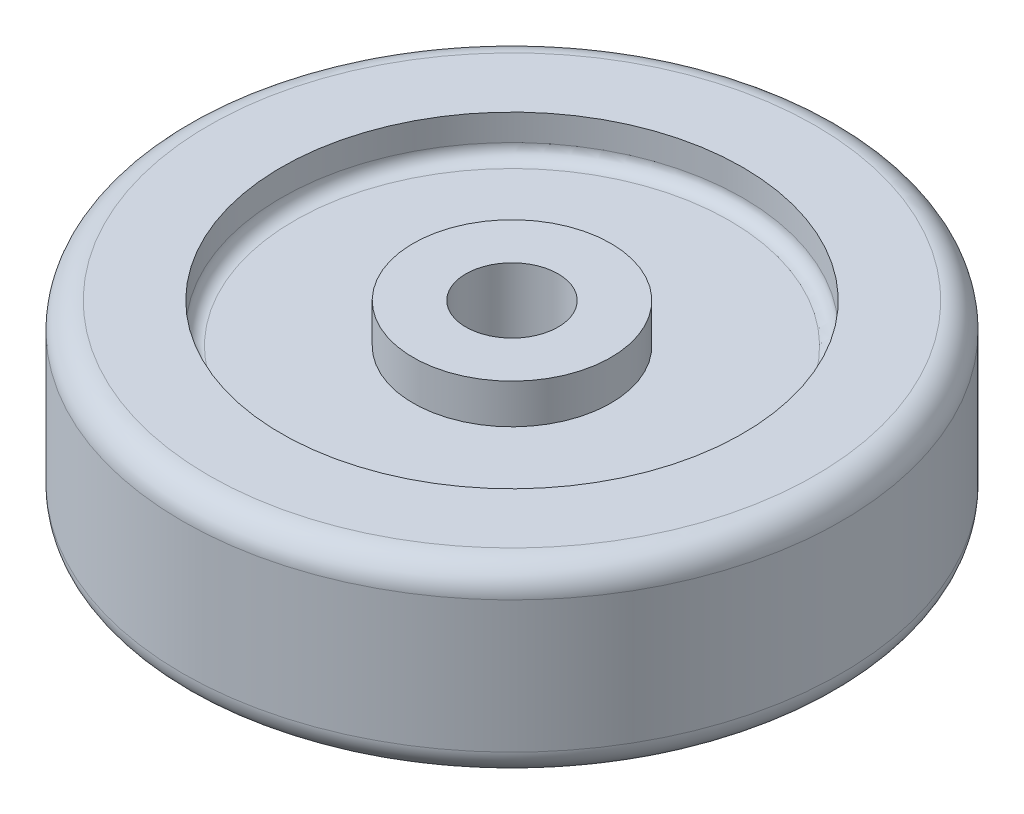
ISO-10303-21;
HEADER;
FILE_DESCRIPTION(('STEP AP214'),'2;1');
FILE_NAME('part.step','',(''),(''),'','','');
FILE_SCHEMA(('AUTOMOTIVE_DESIGN { 1 0 10303 214 1 1 1 1 }'));
ENDSEC;
DATA;
#1=APPLICATION_CONTEXT('core data for automotive mechanical design processes');
#2=APPLICATION_PROTOCOL_DEFINITION('international standard','automotive_design',2000,#1);
#3=PRODUCT_CONTEXT('',#1,'mechanical');
#4=PRODUCT('Part','Part','',(#3));
#5=PRODUCT_RELATED_PRODUCT_CATEGORY('part','',(#4));
#6=PRODUCT_DEFINITION_FORMATION('','',#4);
#7=PRODUCT_DEFINITION_CONTEXT('part definition',#1,'design');
#8=PRODUCT_DEFINITION('design','',#6,#7);
#9=PRODUCT_DEFINITION_SHAPE('','',#8);
#10=(LENGTH_UNIT() NAMED_UNIT(*) SI_UNIT(.MILLI.,.METRE.));
#11=(NAMED_UNIT(*) PLANE_ANGLE_UNIT() SI_UNIT($,.RADIAN.));
#12=(NAMED_UNIT(*) SI_UNIT($,.STERADIAN.) SOLID_ANGLE_UNIT());
#13=UNCERTAINTY_MEASURE_WITH_UNIT(LENGTH_MEASURE(1.E-05),#10,'distance_accuracy_value','');
#14=(GEOMETRIC_REPRESENTATION_CONTEXT(3) GLOBAL_UNCERTAINTY_ASSIGNED_CONTEXT((#13)) GLOBAL_UNIT_ASSIGNED_CONTEXT((#10,
#11,#12)) REPRESENTATION_CONTEXT('',''));
#15=CARTESIAN_POINT('',(0.,0.,0.));
#16=DIRECTION('',(0.,0.,1.));
#17=DIRECTION('',(1.,0.,0.));
#18=AXIS2_PLACEMENT_3D('',#15,#16,#17);
#19=CARTESIAN_POINT('',(-50.,14.,0.));
#20=DIRECTION('',(0.,-1.,0.));
#21=DIRECTION('',(0.,0.,-1.));
#22=AXIS2_PLACEMENT_3D('',#19,#20,#21);
#23=PLANE('',#22);
#24=CARTESIAN_POINT('',(0.,14.,0.));
#25=DIRECTION('',(0.,-1.,0.));
#26=DIRECTION('',(0.,0.,-1.));
#27=AXIS2_PLACEMENT_3D('',#24,#25,#26);
#28=CIRCLE('',#27,46.);
#29=CARTESIAN_POINT('',(0.,14.,-46.));
#30=VERTEX_POINT('',#29);
#31=EDGE_CURVE('E42',#30,#30,#28,.F.);
#32=ORIENTED_EDGE('',*,*,#31,.T.);
#33=EDGE_LOOP('',(#32));
#34=FACE_BOUND('',#33,.T.);
#35=CARTESIAN_POINT('',(0.,14.,0.));
#36=DIRECTION('',(0.,-1.,0.));
#37=DIRECTION('',(0.,0.,-1.));
#38=AXIS2_PLACEMENT_3D('',#35,#36,#37);
#39=CIRCLE('',#38,35.);
#40=CARTESIAN_POINT('',(0.,14.,-35.));
#41=VERTEX_POINT('',#40);
#42=EDGE_CURVE('E57',#41,#41,#39,.T.);
#43=ORIENTED_EDGE('',*,*,#42,.T.);
#44=EDGE_LOOP('',(#43));
#45=FACE_BOUND('',#44,.T.);
#46=ADVANCED_FACE('F31',(#34,#45),#23,.F.);
#47=CARTESIAN_POINT('',(0.,0.,0.));
#48=DIRECTION('',(0.,-1.,0.));
#49=DIRECTION('',(0.,0.,-1.));
#50=AXIS2_PLACEMENT_3D('',#47,#48,#49);
#51=CYLINDRICAL_SURFACE('',#50,35.);
#52=CARTESIAN_POINT('',(0.,10.,0.));
#53=DIRECTION('',(0.,-1.,0.));
#54=DIRECTION('',(0.,0.,-1.));
#55=AXIS2_PLACEMENT_3D('',#52,#53,#54);
#56=CIRCLE('',#55,35.);
#57=CARTESIAN_POINT('',(0.,10.,-35.));
#58=VERTEX_POINT('',#57);
#59=EDGE_CURVE('E38',#58,#58,#56,.T.);
#60=ORIENTED_EDGE('',*,*,#59,.T.);
#61=EDGE_LOOP('',(#60));
#62=FACE_BOUND('',#61,.T.);
#63=ORIENTED_EDGE('',*,*,#42,.F.);
#64=EDGE_LOOP('',(#63));
#65=FACE_BOUND('',#64,.T.);
#66=ADVANCED_FACE('F103',(#62,#65),#51,.F.);
#67=CARTESIAN_POINT('',(-35.,8.,0.));
#68=DIRECTION('',(0.,-1.,0.));
#69=DIRECTION('',(0.,0.,-1.));
#70=AXIS2_PLACEMENT_3D('',#67,#68,#69);
#71=PLANE('',#70);
#72=CARTESIAN_POINT('',(0.,8.,0.));
#73=DIRECTION('',(0.,-1.,0.));
#74=DIRECTION('',(0.,0.,-1.));
#75=AXIS2_PLACEMENT_3D('',#72,#73,#74);
#76=CIRCLE('',#75,33.);
#77=CARTESIAN_POINT('',(0.,8.,-33.));
#78=VERTEX_POINT('',#77);
#79=EDGE_CURVE('E10',#78,#78,#76,.F.);
#80=ORIENTED_EDGE('',*,*,#79,.T.);
#81=EDGE_LOOP('',(#80));
#82=FACE_BOUND('',#81,.T.);
#83=CARTESIAN_POINT('',(0.,8.,0.));
#84=DIRECTION('',(0.,-1.,0.));
#85=DIRECTION('',(0.,0.,-1.));
#86=AXIS2_PLACEMENT_3D('',#83,#84,#85);
#87=CIRCLE('',#86,15.);
#88=CARTESIAN_POINT('',(0.,8.,-15.));
#89=VERTEX_POINT('',#88);
#90=EDGE_CURVE('E60',#89,#89,#87,.T.);
#91=ORIENTED_EDGE('',*,*,#90,.T.);
#92=EDGE_LOOP('',(#91));
#93=FACE_BOUND('',#92,.T.);
#94=ADVANCED_FACE('F109',(#82,#93),#71,.F.);
#95=CARTESIAN_POINT('',(0.,0.,0.));
#96=DIRECTION('',(0.,-1.,0.));
#97=DIRECTION('',(0.,0.,-1.));
#98=AXIS2_PLACEMENT_3D('',#95,#96,#97);
#99=CYLINDRICAL_SURFACE('',#98,15.);
#100=ORIENTED_EDGE('',*,*,#90,.F.);
#101=EDGE_LOOP('',(#100));
#102=FACE_BOUND('',#101,.T.);
#103=CARTESIAN_POINT('',(0.,14.,0.));
#104=DIRECTION('',(0.,-1.,0.));
#105=DIRECTION('',(0.,0.,-1.));
#106=AXIS2_PLACEMENT_3D('',#103,#104,#105);
#107=CIRCLE('',#106,15.);
#108=CARTESIAN_POINT('',(0.,14.,-15.));
#109=VERTEX_POINT('',#108);
#110=EDGE_CURVE('E63',#109,#109,#107,.T.);
#111=ORIENTED_EDGE('',*,*,#110,.T.);
#112=EDGE_LOOP('',(#111));
#113=FACE_BOUND('',#112,.T.);
#114=ADVANCED_FACE('F140',(#102,#113),#99,.T.);
#115=CARTESIAN_POINT('',(-15.,14.,0.));
#116=DIRECTION('',(0.,-1.,0.));
#117=DIRECTION('',(0.,0.,-1.));
#118=AXIS2_PLACEMENT_3D('',#115,#116,#117);
#119=PLANE('',#118);
#120=ORIENTED_EDGE('',*,*,#110,.F.);
#121=EDGE_LOOP('',(#120));
#122=FACE_BOUND('',#121,.T.);
#123=CARTESIAN_POINT('',(0.,14.,0.));
#124=DIRECTION('',(0.,-1.,0.));
#125=DIRECTION('',(0.,0.,-1.));
#126=AXIS2_PLACEMENT_3D('',#123,#124,#125);
#127=CIRCLE('',#126,7.);
#128=CARTESIAN_POINT('',(0.,14.,-7.));
#129=VERTEX_POINT('',#128);
#130=EDGE_CURVE('E66',#129,#129,#127,.T.);
#131=ORIENTED_EDGE('',*,*,#130,.T.);
#132=EDGE_LOOP('',(#131));
#133=FACE_BOUND('',#132,.T.);
#134=ADVANCED_FACE('F215',(#122,#133),#119,.F.);
#135=CARTESIAN_POINT('',(0.,0.,0.));
#136=DIRECTION('',(0.,-1.,0.));
#137=DIRECTION('',(0.,0.,-1.));
#138=AXIS2_PLACEMENT_3D('',#135,#136,#137);
#139=CYLINDRICAL_SURFACE('',#138,7.);
#140=ORIENTED_EDGE('',*,*,#130,.F.);
#141=EDGE_LOOP('',(#140));
#142=FACE_BOUND('',#141,.T.);
#143=CARTESIAN_POINT('',(0.,-14.,0.));
#144=DIRECTION('',(0.,-1.,0.));
#145=DIRECTION('',(0.,0.,-1.));
#146=AXIS2_PLACEMENT_3D('',#143,#144,#145);
#147=CIRCLE('',#146,7.);
#148=CARTESIAN_POINT('',(0.,-14.,-7.));
#149=VERTEX_POINT('',#148);
#150=EDGE_CURVE('E69',#149,#149,#147,.T.);
#151=ORIENTED_EDGE('',*,*,#150,.T.);
#152=EDGE_LOOP('',(#151));
#153=FACE_BOUND('',#152,.T.);
#154=ADVANCED_FACE('F205',(#142,#153),#139,.F.);
#155=CARTESIAN_POINT('',(-15.,-14.,0.));
#156=DIRECTION('',(0.,1.,0.));
#157=DIRECTION('',(0.,0.,1.));
#158=AXIS2_PLACEMENT_3D('',#155,#156,#157);
#159=PLANE('',#158);
#160=ORIENTED_EDGE('',*,*,#150,.F.);
#161=EDGE_LOOP('',(#160));
#162=FACE_BOUND('',#161,.T.);
#163=CARTESIAN_POINT('',(0.,-14.,0.));
#164=DIRECTION('',(0.,-1.,0.));
#165=DIRECTION('',(0.,0.,-1.));
#166=AXIS2_PLACEMENT_3D('',#163,#164,#165);
#167=CIRCLE('',#166,15.);
#168=CARTESIAN_POINT('',(0.,-14.,-15.));
#169=VERTEX_POINT('',#168);
#170=EDGE_CURVE('E72',#169,#169,#167,.T.);
#171=ORIENTED_EDGE('',*,*,#170,.T.);
#172=EDGE_LOOP('',(#171));
#173=FACE_BOUND('',#172,.T.);
#174=ADVANCED_FACE('F195',(#162,#173),#159,.F.);
#175=CARTESIAN_POINT('',(0.,0.,0.));
#176=DIRECTION('',(0.,-1.,0.));
#177=DIRECTION('',(0.,0.,-1.));
#178=AXIS2_PLACEMENT_3D('',#175,#176,#177);
#179=CYLINDRICAL_SURFACE('',#178,15.);
#180=ORIENTED_EDGE('',*,*,#170,.F.);
#181=EDGE_LOOP('',(#180));
#182=FACE_BOUND('',#181,.T.);
#183=CARTESIAN_POINT('',(0.,-7.99999999999999,0.));
#184=DIRECTION('',(0.,-1.,0.));
#185=DIRECTION('',(0.,0.,-1.));
#186=AXIS2_PLACEMENT_3D('',#183,#184,#185);
#187=CIRCLE('',#186,15.);
#188=CARTESIAN_POINT('',(0.,-7.99999999999999,-15.));
#189=VERTEX_POINT('',#188);
#190=EDGE_CURVE('E75',#189,#189,#187,.T.);
#191=ORIENTED_EDGE('',*,*,#190,.T.);
#192=EDGE_LOOP('',(#191));
#193=FACE_BOUND('',#192,.T.);
#194=ADVANCED_FACE('F185',(#182,#193),#179,.T.);
#195=CARTESIAN_POINT('',(-35.,-7.99999999999999,0.));
#196=DIRECTION('',(0.,1.,0.));
#197=DIRECTION('',(0.,0.,1.));
#198=AXIS2_PLACEMENT_3D('',#195,#196,#197);
#199=PLANE('',#198);
#200=ORIENTED_EDGE('',*,*,#190,.F.);
#201=EDGE_LOOP('',(#200));
#202=FACE_BOUND('',#201,.T.);
#203=CARTESIAN_POINT('',(0.,-8.,0.));
#204=DIRECTION('',(0.,-1.,0.));
#205=DIRECTION('',(0.,0.,-1.));
#206=AXIS2_PLACEMENT_3D('',#203,#204,#205);
#207=CIRCLE('',#206,35.);
#208=CARTESIAN_POINT('',(0.,-8.,-35.));
#209=VERTEX_POINT('',#208);
#210=EDGE_CURVE('E78',#209,#209,#207,.T.);
#211=ORIENTED_EDGE('',*,*,#210,.T.);
#212=EDGE_LOOP('',(#211));
#213=FACE_BOUND('',#212,.T.);
#214=ADVANCED_FACE('F99',(#202,#213),#199,.F.);
#215=CARTESIAN_POINT('',(0.,0.,0.));
#216=DIRECTION('',(0.,-1.,0.));
#217=DIRECTION('',(0.,0.,-1.));
#218=AXIS2_PLACEMENT_3D('',#215,#216,#217);
#219=CYLINDRICAL_SURFACE('',#218,35.);
#220=ORIENTED_EDGE('',*,*,#210,.F.);
#221=EDGE_LOOP('',(#220));
#222=FACE_BOUND('',#221,.T.);
#223=CARTESIAN_POINT('',(0.,-14.,0.));
#224=DIRECTION('',(0.,-1.,0.));
#225=DIRECTION('',(0.,0.,-1.));
#226=AXIS2_PLACEMENT_3D('',#223,#224,#225);
#227=CIRCLE('',#226,35.);
#228=CARTESIAN_POINT('',(0.,-14.,-35.));
#229=VERTEX_POINT('',#228);
#230=EDGE_CURVE('E81',#229,#229,#227,.T.);
#231=ORIENTED_EDGE('',*,*,#230,.T.);
#232=EDGE_LOOP('',(#231));
#233=FACE_BOUND('',#232,.T.);
#234=ADVANCED_FACE('F85',(#222,#233),#219,.F.);
#235=CARTESIAN_POINT('',(-50.,-14.,0.));
#236=DIRECTION('',(0.,1.,0.));
#237=DIRECTION('',(0.,0.,1.));
#238=AXIS2_PLACEMENT_3D('',#235,#236,#237);
#239=PLANE('',#238);
#240=CARTESIAN_POINT('',(0.,-14.,0.));
#241=DIRECTION('',(0.,1.,0.));
#242=DIRECTION('',(0.,0.,1.));
#243=AXIS2_PLACEMENT_3D('',#240,#241,#242);
#244=CIRCLE('',#243,46.);
#245=CARTESIAN_POINT('',(0.,-14.,46.));
#246=VERTEX_POINT('',#245);
#247=EDGE_CURVE('E54',#246,#246,#244,.F.);
#248=ORIENTED_EDGE('',*,*,#247,.T.);
#249=EDGE_LOOP('',(#248));
#250=FACE_BOUND('',#249,.T.);
#251=ORIENTED_EDGE('',*,*,#230,.F.);
#252=EDGE_LOOP('',(#251));
#253=FACE_BOUND('',#252,.T.);
#254=ADVANCED_FACE('F87',(#250,#253),#239,.F.);
#255=CARTESIAN_POINT('',(0.,0.,0.));
#256=DIRECTION('',(0.,-1.,0.));
#257=DIRECTION('',(0.,0.,-1.));
#258=AXIS2_PLACEMENT_3D('',#255,#256,#257);
#259=CYLINDRICAL_SURFACE('',#258,50.);
#260=CARTESIAN_POINT('',(0.,-10.,0.));
#261=DIRECTION('',(0.,1.,0.));
#262=DIRECTION('',(0.,0.,1.));
#263=AXIS2_PLACEMENT_3D('',#260,#261,#262);
#264=CIRCLE('',#263,50.);
#265=CARTESIAN_POINT('',(0.,-10.,50.));
#266=VERTEX_POINT('',#265);
#267=EDGE_CURVE('E46',#266,#266,#264,.T.);
#268=ORIENTED_EDGE('',*,*,#267,.T.);
#269=EDGE_LOOP('',(#268));
#270=FACE_BOUND('',#269,.T.);
#271=CARTESIAN_POINT('',(0.,10.,0.));
#272=DIRECTION('',(0.,-1.,0.));
#273=DIRECTION('',(0.,0.,-1.));
#274=AXIS2_PLACEMENT_3D('',#271,#272,#273);
#275=CIRCLE('',#274,50.);
#276=CARTESIAN_POINT('',(0.,10.,-50.));
#277=VERTEX_POINT('',#276);
#278=EDGE_CURVE('E51',#277,#277,#275,.T.);
#279=ORIENTED_EDGE('',*,*,#278,.T.);
#280=EDGE_LOOP('',(#279));
#281=FACE_BOUND('',#280,.T.);
#282=ADVANCED_FACE('F89',(#270,#281),#259,.T.);
#283=CARTESIAN_POINT('',(0.,-10.,0.));
#284=DIRECTION('',(0.,1.,0.));
#285=DIRECTION('',(0.,0.,1.));
#286=AXIS2_PLACEMENT_3D('',#283,#284,#285);
#287=TOROIDAL_SURFACE('',#286,46.,4.);
#288=ORIENTED_EDGE('',*,*,#267,.F.);
#289=EDGE_LOOP('',(#288));
#290=FACE_BOUND('',#289,.T.);
#291=ORIENTED_EDGE('',*,*,#247,.F.);
#292=EDGE_LOOP('',(#291));
#293=FACE_BOUND('',#292,.T.);
#294=ADVANCED_FACE('F96',(#290,#293),#287,.T.);
#295=CARTESIAN_POINT('',(0.,10.,0.));
#296=DIRECTION('',(0.,-1.,0.));
#297=DIRECTION('',(0.,0.,-1.));
#298=AXIS2_PLACEMENT_3D('',#295,#296,#297);
#299=TOROIDAL_SURFACE('',#298,46.,4.);
#300=ORIENTED_EDGE('',*,*,#31,.F.);
#301=EDGE_LOOP('',(#300));
#302=FACE_BOUND('',#301,.T.);
#303=ORIENTED_EDGE('',*,*,#278,.F.);
#304=EDGE_LOOP('',(#303));
#305=FACE_BOUND('',#304,.T.);
#306=ADVANCED_FACE('F115',(#302,#305),#299,.T.);
#307=CARTESIAN_POINT('',(0.,10.,0.));
#308=DIRECTION('',(0.,-1.,0.));
#309=DIRECTION('',(0.,0.,-1.));
#310=AXIS2_PLACEMENT_3D('',#307,#308,#309);
#311=TOROIDAL_SURFACE('',#310,33.,2.);
#312=ORIENTED_EDGE('',*,*,#79,.F.);
#313=EDGE_LOOP('',(#312));
#314=FACE_BOUND('',#313,.T.);
#315=ORIENTED_EDGE('',*,*,#59,.F.);
#316=EDGE_LOOP('',(#315));
#317=FACE_BOUND('',#316,.T.);
#318=ADVANCED_FACE('F33',(#314,#317),#311,.F.);
#319=CLOSED_SHELL('',(#46,#66,#94,#114,#134,#154,#174,#194,#214,#234,#254,#282,#294,#306,#318));
#320=MANIFOLD_SOLID_BREP('B2',#319);
#321=ADVANCED_BREP_SHAPE_REPRESENTATION('',(#18,#320),#14);
#322=SHAPE_DEFINITION_REPRESENTATION(#9,#321);
ENDSEC;
END-ISO-10303-21;
